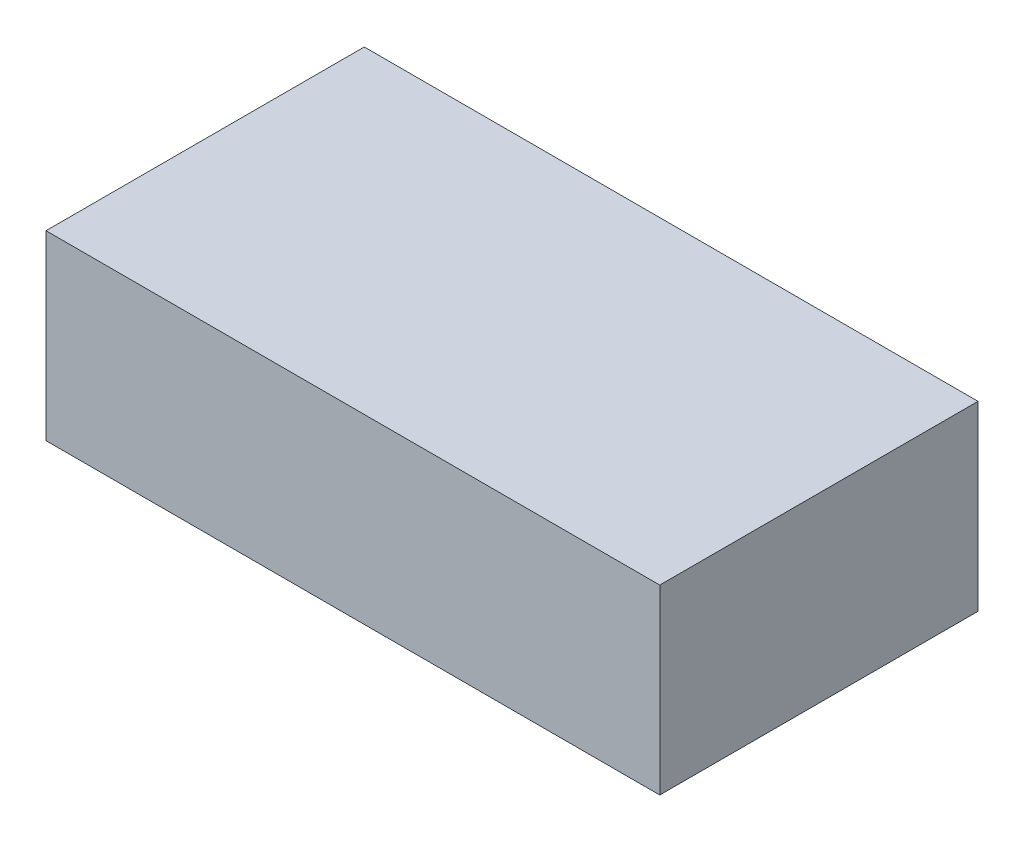
ISO-10303-21;
HEADER;
FILE_DESCRIPTION(('STEP AP214'),'2;1');
FILE_NAME('part.step','',(''),(''),'','','');
FILE_SCHEMA(('AUTOMOTIVE_DESIGN { 1 0 10303 214 1 1 1 1 }'));
ENDSEC;
DATA;
#1=APPLICATION_CONTEXT('core data for automotive mechanical design processes');
#2=APPLICATION_PROTOCOL_DEFINITION('international standard','automotive_design',2000,#1);
#3=PRODUCT_CONTEXT('',#1,'mechanical');
#4=PRODUCT('Part','Part','',(#3));
#5=PRODUCT_RELATED_PRODUCT_CATEGORY('part','',(#4));
#6=PRODUCT_DEFINITION_FORMATION('','',#4);
#7=PRODUCT_DEFINITION_CONTEXT('part definition',#1,'design');
#8=PRODUCT_DEFINITION('design','',#6,#7);
#9=PRODUCT_DEFINITION_SHAPE('','',#8);
#10=(LENGTH_UNIT() NAMED_UNIT(*) SI_UNIT(.MILLI.,.METRE.));
#11=(NAMED_UNIT(*) PLANE_ANGLE_UNIT() SI_UNIT($,.RADIAN.));
#12=(NAMED_UNIT(*) SI_UNIT($,.STERADIAN.) SOLID_ANGLE_UNIT());
#13=UNCERTAINTY_MEASURE_WITH_UNIT(LENGTH_MEASURE(1.E-05),#10,'distance_accuracy_value','');
#14=(GEOMETRIC_REPRESENTATION_CONTEXT(3) GLOBAL_UNCERTAINTY_ASSIGNED_CONTEXT((#13)) GLOBAL_UNIT_ASSIGNED_CONTEXT((#10,
#11,#12)) REPRESENTATION_CONTEXT('',''));
#15=CARTESIAN_POINT('',(0.,0.,0.));
#16=DIRECTION('',(0.,0.,1.));
#17=DIRECTION('',(1.,0.,0.));
#18=AXIS2_PLACEMENT_3D('',#15,#16,#17);
#19=CARTESIAN_POINT('',(13.5,8.,7.));
#20=DIRECTION('',(-1.,0.,0.));
#21=DIRECTION('',(0.,0.,1.));
#22=AXIS2_PLACEMENT_3D('',#19,#20,#21);
#23=PLANE('',#22);
#24=DIRECTION('',(0.,0.,-1.));
#25=VECTOR('',#24,1.);
#26=CARTESIAN_POINT('',(13.5,0.,7.));
#27=LINE('',#26,#25);
#28=CARTESIAN_POINT('',(13.5,0.,7.));
#29=VERTEX_POINT('',#28);
#30=CARTESIAN_POINT('',(13.5,0.,-7.));
#31=VERTEX_POINT('',#30);
#32=EDGE_CURVE('E106',#29,#31,#27,.T.);
#33=ORIENTED_EDGE('',*,*,#32,.T.);
#34=DIRECTION('',(0.,-1.,0.));
#35=VECTOR('',#34,1.);
#36=CARTESIAN_POINT('',(13.5,8.,-7.));
#37=LINE('',#36,#35);
#38=CARTESIAN_POINT('',(13.5,8.,-7.));
#39=VERTEX_POINT('',#38);
#40=EDGE_CURVE('E11',#39,#31,#37,.T.);
#41=ORIENTED_EDGE('',*,*,#40,.F.);
#42=DIRECTION('',(0.,0.,-1.));
#43=VECTOR('',#42,1.);
#44=CARTESIAN_POINT('',(13.5,8.,7.));
#45=LINE('',#44,#43);
#46=CARTESIAN_POINT('',(13.5,8.,7.));
#47=VERTEX_POINT('',#46);
#48=EDGE_CURVE('E94',#47,#39,#45,.T.);
#49=ORIENTED_EDGE('',*,*,#48,.F.);
#50=DIRECTION('',(0.,-1.,0.));
#51=VECTOR('',#50,1.);
#52=CARTESIAN_POINT('',(13.5,8.,7.));
#53=LINE('',#52,#51);
#54=EDGE_CURVE('E105',#47,#29,#53,.T.);
#55=ORIENTED_EDGE('',*,*,#54,.T.);
#56=EDGE_LOOP('',(#33,#41,#49,#55));
#57=FACE_BOUND('',#56,.T.);
#58=ADVANCED_FACE('F43',(#57),#23,.F.);
#59=CARTESIAN_POINT('',(-13.5,8.,-7.));
#60=DIRECTION('',(0.,0.,1.));
#61=DIRECTION('',(1.,0.,0.));
#62=AXIS2_PLACEMENT_3D('',#59,#60,#61);
#63=PLANE('',#62);
#64=DIRECTION('',(-1.,0.,0.));
#65=VECTOR('',#64,1.);
#66=CARTESIAN_POINT('',(-13.5,0.,-7.));
#67=LINE('',#66,#65);
#68=CARTESIAN_POINT('',(-13.5,0.,-7.));
#69=VERTEX_POINT('',#68);
#70=EDGE_CURVE('E98',#31,#69,#67,.T.);
#71=ORIENTED_EDGE('',*,*,#70,.T.);
#72=DIRECTION('',(0.,-1.,0.));
#73=VECTOR('',#72,1.);
#74=CARTESIAN_POINT('',(-13.5,8.,-7.));
#75=LINE('',#74,#73);
#76=CARTESIAN_POINT('',(-13.5,8.,-7.));
#77=VERTEX_POINT('',#76);
#78=EDGE_CURVE('E51',#77,#69,#75,.T.);
#79=ORIENTED_EDGE('',*,*,#78,.F.);
#80=DIRECTION('',(-1.,0.,0.));
#81=VECTOR('',#80,1.);
#82=CARTESIAN_POINT('',(-13.5,8.,-7.));
#83=LINE('',#82,#81);
#84=EDGE_CURVE('E90',#39,#77,#83,.T.);
#85=ORIENTED_EDGE('',*,*,#84,.F.);
#86=ORIENTED_EDGE('',*,*,#40,.T.);
#87=EDGE_LOOP('',(#71,#79,#85,#86));
#88=FACE_BOUND('',#87,.T.);
#89=ADVANCED_FACE('F100',(#88),#63,.F.);
#90=CARTESIAN_POINT('',(-13.5,8.,7.));
#91=DIRECTION('',(1.,0.,0.));
#92=DIRECTION('',(0.,0.,-1.));
#93=AXIS2_PLACEMENT_3D('',#90,#91,#92);
#94=PLANE('',#93);
#95=DIRECTION('',(0.,0.,1.));
#96=VECTOR('',#95,1.);
#97=CARTESIAN_POINT('',(-13.5,0.,7.));
#98=LINE('',#97,#96);
#99=CARTESIAN_POINT('',(-13.5,0.,7.));
#100=VERTEX_POINT('',#99);
#101=EDGE_CURVE('E76',#69,#100,#98,.T.);
#102=ORIENTED_EDGE('',*,*,#101,.T.);
#103=DIRECTION('',(0.,-1.,0.));
#104=VECTOR('',#103,1.);
#105=CARTESIAN_POINT('',(-13.5,8.,7.));
#106=LINE('',#105,#104);
#107=CARTESIAN_POINT('',(-13.5,8.,7.));
#108=VERTEX_POINT('',#107);
#109=EDGE_CURVE('E97',#108,#100,#106,.T.);
#110=ORIENTED_EDGE('',*,*,#109,.F.);
#111=DIRECTION('',(0.,0.,1.));
#112=VECTOR('',#111,1.);
#113=CARTESIAN_POINT('',(-13.5,8.,7.));
#114=LINE('',#113,#112);
#115=EDGE_CURVE('E95',#77,#108,#114,.T.);
#116=ORIENTED_EDGE('',*,*,#115,.F.);
#117=ORIENTED_EDGE('',*,*,#78,.T.);
#118=EDGE_LOOP('',(#102,#110,#116,#117));
#119=FACE_BOUND('',#118,.T.);
#120=ADVANCED_FACE('F99',(#119),#94,.F.);
#121=CARTESIAN_POINT('',(-13.5,8.,7.));
#122=DIRECTION('',(0.,0.,-1.));
#123=DIRECTION('',(-1.,0.,0.));
#124=AXIS2_PLACEMENT_3D('',#121,#122,#123);
#125=PLANE('',#124);
#126=DIRECTION('',(1.,0.,0.));
#127=VECTOR('',#126,1.);
#128=CARTESIAN_POINT('',(-13.5,0.,7.));
#129=LINE('',#128,#127);
#130=EDGE_CURVE('E85',#100,#29,#129,.T.);
#131=ORIENTED_EDGE('',*,*,#130,.T.);
#132=ORIENTED_EDGE('',*,*,#54,.F.);
#133=DIRECTION('',(1.,0.,0.));
#134=VECTOR('',#133,1.);
#135=CARTESIAN_POINT('',(-13.5,8.,7.));
#136=LINE('',#135,#134);
#137=EDGE_CURVE('E56',#108,#47,#136,.T.);
#138=ORIENTED_EDGE('',*,*,#137,.F.);
#139=ORIENTED_EDGE('',*,*,#109,.T.);
#140=EDGE_LOOP('',(#131,#132,#138,#139));
#141=FACE_BOUND('',#140,.T.);
#142=ADVANCED_FACE('F114',(#141),#125,.F.);
#143=CARTESIAN_POINT('',(0.,8.,0.));
#144=DIRECTION('',(0.,-1.,0.));
#145=DIRECTION('',(0.,0.,-1.));
#146=AXIS2_PLACEMENT_3D('',#143,#144,#145);
#147=PLANE('',#146);
#148=ORIENTED_EDGE('',*,*,#48,.T.);
#149=ORIENTED_EDGE('',*,*,#84,.T.);
#150=ORIENTED_EDGE('',*,*,#115,.T.);
#151=ORIENTED_EDGE('',*,*,#137,.T.);
#152=EDGE_LOOP('',(#148,#149,#150,#151));
#153=FACE_BOUND('',#152,.T.);
#154=ADVANCED_FACE('F89',(#153),#147,.F.);
#155=CARTESIAN_POINT('',(0.,0.,0.));
#156=DIRECTION('',(0.,-1.,0.));
#157=DIRECTION('',(0.,0.,-1.));
#158=AXIS2_PLACEMENT_3D('',#155,#156,#157);
#159=PLANE('',#158);
#160=ORIENTED_EDGE('',*,*,#32,.F.);
#161=ORIENTED_EDGE('',*,*,#130,.F.);
#162=ORIENTED_EDGE('',*,*,#101,.F.);
#163=ORIENTED_EDGE('',*,*,#70,.F.);
#164=EDGE_LOOP('',(#160,#161,#162,#163));
#165=FACE_BOUND('',#164,.T.);
#166=ADVANCED_FACE('F116',(#165),#159,.T.);
#167=CLOSED_SHELL('',(#58,#89,#120,#142,#154,#166));
#168=MANIFOLD_SOLID_BREP('B2',#167);
#169=ADVANCED_BREP_SHAPE_REPRESENTATION('',(#18,#168),#14);
#170=SHAPE_DEFINITION_REPRESENTATION(#9,#169);
ENDSEC;
END-ISO-10303-21;
